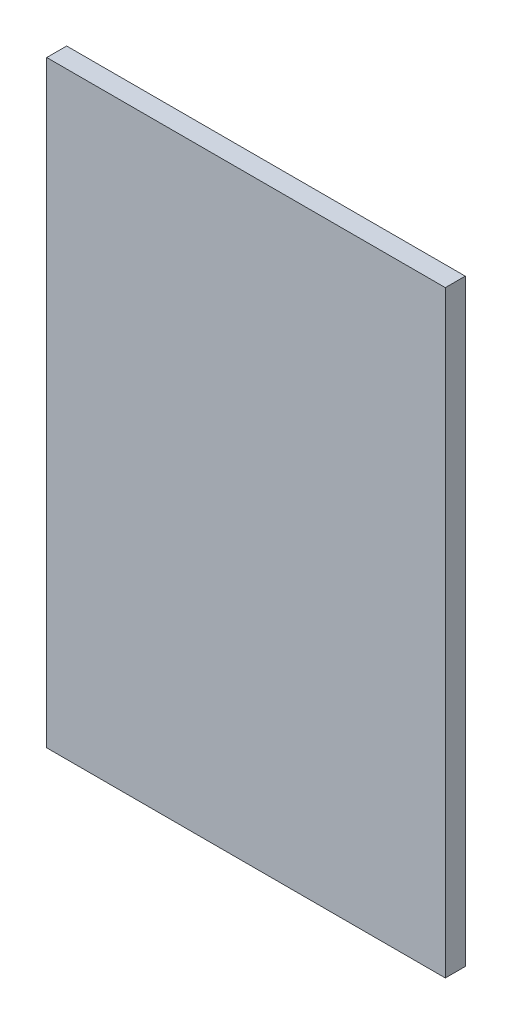
ISO-10303-21;
HEADER;
FILE_DESCRIPTION(('STEP AP214'),'2;1');
FILE_NAME('part.step','',(''),(''),'','','');
FILE_SCHEMA(('AUTOMOTIVE_DESIGN { 1 0 10303 214 1 1 1 1 }'));
ENDSEC;
DATA;
#1=APPLICATION_CONTEXT('core data for automotive mechanical design processes');
#2=APPLICATION_PROTOCOL_DEFINITION('international standard','automotive_design',2000,#1);
#3=PRODUCT_CONTEXT('',#1,'mechanical');
#4=PRODUCT('Part','Part','',(#3));
#5=PRODUCT_RELATED_PRODUCT_CATEGORY('part','',(#4));
#6=PRODUCT_DEFINITION_FORMATION('','',#4);
#7=PRODUCT_DEFINITION_CONTEXT('part definition',#1,'design');
#8=PRODUCT_DEFINITION('design','',#6,#7);
#9=PRODUCT_DEFINITION_SHAPE('','',#8);
#10=(LENGTH_UNIT() NAMED_UNIT(*) SI_UNIT(.MILLI.,.METRE.));
#11=(NAMED_UNIT(*) PLANE_ANGLE_UNIT() SI_UNIT($,.RADIAN.));
#12=(NAMED_UNIT(*) SI_UNIT($,.STERADIAN.) SOLID_ANGLE_UNIT());
#13=UNCERTAINTY_MEASURE_WITH_UNIT(LENGTH_MEASURE(1.E-05),#10,'distance_accuracy_value','');
#14=(GEOMETRIC_REPRESENTATION_CONTEXT(3) GLOBAL_UNCERTAINTY_ASSIGNED_CONTEXT((#13)) GLOBAL_UNIT_ASSIGNED_CONTEXT((#10,
#11,#12)) REPRESENTATION_CONTEXT('',''));
#15=CARTESIAN_POINT('',(0.,0.,0.));
#16=DIRECTION('',(0.,0.,1.));
#17=DIRECTION('',(1.,0.,0.));
#18=AXIS2_PLACEMENT_3D('',#15,#16,#17);
#19=CARTESIAN_POINT('',(-100.,150.,10.));
#20=DIRECTION('',(1.,0.,0.));
#21=DIRECTION('',(0.,1.,0.));
#22=AXIS2_PLACEMENT_3D('',#19,#20,#21);
#23=PLANE('',#22);
#24=DIRECTION('',(0.,-1.,0.));
#25=VECTOR('',#24,1.);
#26=CARTESIAN_POINT('',(-100.,150.,0.));
#27=LINE('',#26,#25);
#28=CARTESIAN_POINT('',(-100.,150.,0.));
#29=VERTEX_POINT('',#28);
#30=CARTESIAN_POINT('',(-100.,-150.,0.));
#31=VERTEX_POINT('',#30);
#32=EDGE_CURVE('E112',#29,#31,#27,.T.);
#33=ORIENTED_EDGE('',*,*,#32,.T.);
#34=DIRECTION('',(0.,0.,-1.));
#35=VECTOR('',#34,1.);
#36=CARTESIAN_POINT('',(-100.,-150.,10.));
#37=LINE('',#36,#35);
#38=CARTESIAN_POINT('',(-100.,-150.,10.));
#39=VERTEX_POINT('',#38);
#40=EDGE_CURVE('E11',#39,#31,#37,.T.);
#41=ORIENTED_EDGE('',*,*,#40,.F.);
#42=DIRECTION('',(0.,-1.,0.));
#43=VECTOR('',#42,1.);
#44=CARTESIAN_POINT('',(-100.,150.,10.));
#45=LINE('',#44,#43);
#46=CARTESIAN_POINT('',(-100.,150.,10.));
#47=VERTEX_POINT('',#46);
#48=EDGE_CURVE('E95',#47,#39,#45,.T.);
#49=ORIENTED_EDGE('',*,*,#48,.F.);
#50=DIRECTION('',(0.,0.,-1.));
#51=VECTOR('',#50,1.);
#52=CARTESIAN_POINT('',(-100.,150.,10.));
#53=LINE('',#52,#51);
#54=EDGE_CURVE('E108',#47,#29,#53,.T.);
#55=ORIENTED_EDGE('',*,*,#54,.T.);
#56=EDGE_LOOP('',(#33,#41,#49,#55));
#57=FACE_BOUND('',#56,.T.);
#58=ADVANCED_FACE('F44',(#57),#23,.F.);
#59=CARTESIAN_POINT('',(-100.,-150.,10.));
#60=DIRECTION('',(0.,1.,0.));
#61=DIRECTION('',(0.,0.,1.));
#62=AXIS2_PLACEMENT_3D('',#59,#60,#61);
#63=PLANE('',#62);
#64=DIRECTION('',(1.,0.,0.));
#65=VECTOR('',#64,1.);
#66=CARTESIAN_POINT('',(-100.,-150.,0.));
#67=LINE('',#66,#65);
#68=CARTESIAN_POINT('',(100.,-150.,0.));
#69=VERTEX_POINT('',#68);
#70=EDGE_CURVE('E100',#31,#69,#67,.T.);
#71=ORIENTED_EDGE('',*,*,#70,.T.);
#72=DIRECTION('',(0.,0.,-1.));
#73=VECTOR('',#72,1.);
#74=CARTESIAN_POINT('',(100.,-150.,10.));
#75=LINE('',#74,#73);
#76=CARTESIAN_POINT('',(100.,-150.,10.));
#77=VERTEX_POINT('',#76);
#78=EDGE_CURVE('E52',#77,#69,#75,.T.);
#79=ORIENTED_EDGE('',*,*,#78,.F.);
#80=DIRECTION('',(1.,0.,0.));
#81=VECTOR('',#80,1.);
#82=CARTESIAN_POINT('',(-100.,-150.,10.));
#83=LINE('',#82,#81);
#84=EDGE_CURVE('E90',#39,#77,#83,.T.);
#85=ORIENTED_EDGE('',*,*,#84,.F.);
#86=ORIENTED_EDGE('',*,*,#40,.T.);
#87=EDGE_LOOP('',(#71,#79,#85,#86));
#88=FACE_BOUND('',#87,.T.);
#89=ADVANCED_FACE('F99',(#88),#63,.F.);
#90=CARTESIAN_POINT('',(100.,150.,10.));
#91=DIRECTION('',(-1.,0.,0.));
#92=DIRECTION('',(0.,0.,1.));
#93=AXIS2_PLACEMENT_3D('',#90,#91,#92);
#94=PLANE('',#93);
#95=DIRECTION('',(0.,1.,0.));
#96=VECTOR('',#95,1.);
#97=CARTESIAN_POINT('',(100.,150.,0.));
#98=LINE('',#97,#96);
#99=CARTESIAN_POINT('',(100.,150.,0.));
#100=VERTEX_POINT('',#99);
#101=EDGE_CURVE('E77',#69,#100,#98,.T.);
#102=ORIENTED_EDGE('',*,*,#101,.T.);
#103=DIRECTION('',(0.,0.,-1.));
#104=VECTOR('',#103,1.);
#105=CARTESIAN_POINT('',(100.,150.,10.));
#106=LINE('',#105,#104);
#107=CARTESIAN_POINT('',(100.,150.,10.));
#108=VERTEX_POINT('',#107);
#109=EDGE_CURVE('E101',#108,#100,#106,.T.);
#110=ORIENTED_EDGE('',*,*,#109,.F.);
#111=DIRECTION('',(0.,1.,0.));
#112=VECTOR('',#111,1.);
#113=CARTESIAN_POINT('',(100.,150.,10.));
#114=LINE('',#113,#112);
#115=EDGE_CURVE('E93',#77,#108,#114,.T.);
#116=ORIENTED_EDGE('',*,*,#115,.F.);
#117=ORIENTED_EDGE('',*,*,#78,.T.);
#118=EDGE_LOOP('',(#102,#110,#116,#117));
#119=FACE_BOUND('',#118,.T.);
#120=ADVANCED_FACE('F102',(#119),#94,.F.);
#121=CARTESIAN_POINT('',(-100.,150.,10.));
#122=DIRECTION('',(0.,-1.,0.));
#123=DIRECTION('',(0.,0.,-1.));
#124=AXIS2_PLACEMENT_3D('',#121,#122,#123);
#125=PLANE('',#124);
#126=DIRECTION('',(-1.,0.,0.));
#127=VECTOR('',#126,1.);
#128=CARTESIAN_POINT('',(-100.,150.,0.));
#129=LINE('',#128,#127);
#130=EDGE_CURVE('E83',#100,#29,#129,.T.);
#131=ORIENTED_EDGE('',*,*,#130,.T.);
#132=ORIENTED_EDGE('',*,*,#54,.F.);
#133=DIRECTION('',(-1.,0.,0.));
#134=VECTOR('',#133,1.);
#135=CARTESIAN_POINT('',(-100.,150.,10.));
#136=LINE('',#135,#134);
#137=EDGE_CURVE('E60',#108,#47,#136,.T.);
#138=ORIENTED_EDGE('',*,*,#137,.F.);
#139=ORIENTED_EDGE('',*,*,#109,.T.);
#140=EDGE_LOOP('',(#131,#132,#138,#139));
#141=FACE_BOUND('',#140,.T.);
#142=ADVANCED_FACE('F122',(#141),#125,.F.);
#143=CARTESIAN_POINT('',(0.,0.,10.));
#144=DIRECTION('',(0.,0.,1.));
#145=DIRECTION('',(1.,0.,0.));
#146=AXIS2_PLACEMENT_3D('',#143,#144,#145);
#147=PLANE('',#146);
#148=ORIENTED_EDGE('',*,*,#48,.T.);
#149=ORIENTED_EDGE('',*,*,#84,.T.);
#150=ORIENTED_EDGE('',*,*,#115,.T.);
#151=ORIENTED_EDGE('',*,*,#137,.T.);
#152=EDGE_LOOP('',(#148,#149,#150,#151));
#153=FACE_BOUND('',#152,.T.);
#154=ADVANCED_FACE('F91',(#153),#147,.T.);
#155=CARTESIAN_POINT('',(0.,0.,0.));
#156=DIRECTION('',(0.,0.,1.));
#157=DIRECTION('',(1.,0.,0.));
#158=AXIS2_PLACEMENT_3D('',#155,#156,#157);
#159=PLANE('',#158);
#160=ORIENTED_EDGE('',*,*,#32,.F.);
#161=ORIENTED_EDGE('',*,*,#130,.F.);
#162=ORIENTED_EDGE('',*,*,#101,.F.);
#163=ORIENTED_EDGE('',*,*,#70,.F.);
#164=EDGE_LOOP('',(#160,#161,#162,#163));
#165=FACE_BOUND('',#164,.T.);
#166=ADVANCED_FACE('F125',(#165),#159,.F.);
#167=CLOSED_SHELL('',(#58,#89,#120,#142,#154,#166));
#168=MANIFOLD_SOLID_BREP('B2',#167);
#169=ADVANCED_BREP_SHAPE_REPRESENTATION('',(#18,#168),#14);
#170=SHAPE_DEFINITION_REPRESENTATION(#9,#169);
ENDSEC;
END-ISO-10303-21;
